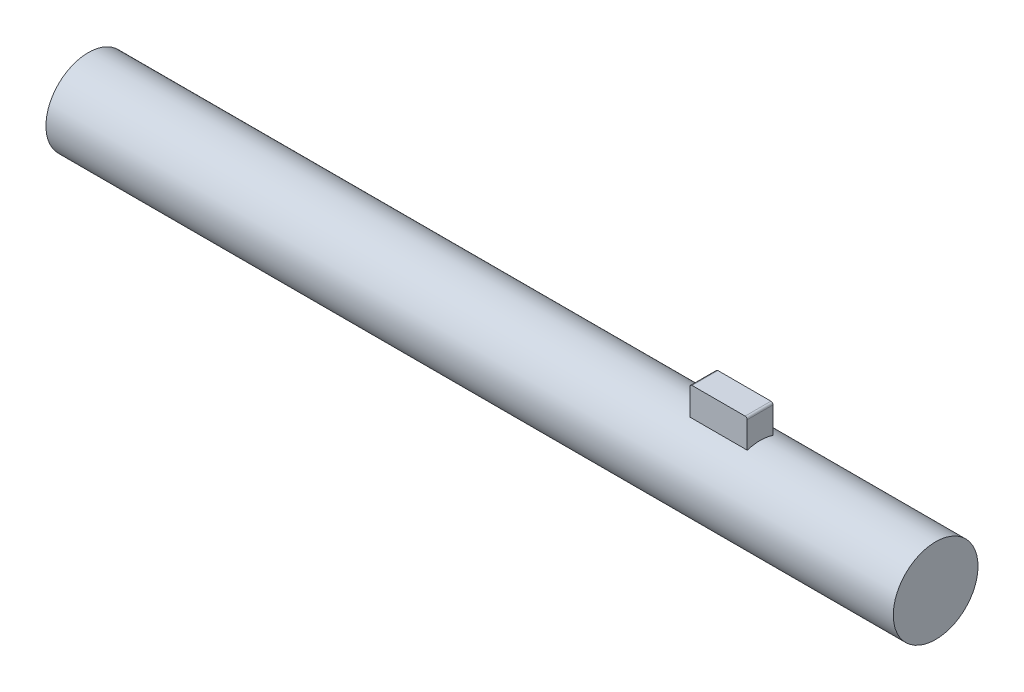
ISO-10303-21;
HEADER;
FILE_DESCRIPTION(('STEP AP214'),'2;1');
FILE_NAME('part.step','',(''),(''),'','','');
FILE_SCHEMA(('AUTOMOTIVE_DESIGN { 1 0 10303 214 1 1 1 1 }'));
ENDSEC;
DATA;
#1=APPLICATION_CONTEXT('core data for automotive mechanical design processes');
#2=APPLICATION_PROTOCOL_DEFINITION('international standard','automotive_design',2000,#1);
#3=PRODUCT_CONTEXT('',#1,'mechanical');
#4=PRODUCT('Part','Part','',(#3));
#5=PRODUCT_RELATED_PRODUCT_CATEGORY('part','',(#4));
#6=PRODUCT_DEFINITION_FORMATION('','',#4);
#7=PRODUCT_DEFINITION_CONTEXT('part definition',#1,'design');
#8=PRODUCT_DEFINITION('design','',#6,#7);
#9=PRODUCT_DEFINITION_SHAPE('','',#8);
#10=(LENGTH_UNIT() NAMED_UNIT(*) SI_UNIT(.MILLI.,.METRE.));
#11=(NAMED_UNIT(*) PLANE_ANGLE_UNIT() SI_UNIT($,.RADIAN.));
#12=(NAMED_UNIT(*) SI_UNIT($,.STERADIAN.) SOLID_ANGLE_UNIT());
#13=UNCERTAINTY_MEASURE_WITH_UNIT(LENGTH_MEASURE(1.E-05),#10,'distance_accuracy_value','');
#14=(GEOMETRIC_REPRESENTATION_CONTEXT(3) GLOBAL_UNCERTAINTY_ASSIGNED_CONTEXT((#13)) GLOBAL_UNIT_ASSIGNED_CONTEXT((#10,
#11,#12)) REPRESENTATION_CONTEXT('',''));
#15=CARTESIAN_POINT('',(0.,0.,0.));
#16=DIRECTION('',(0.,0.,1.));
#17=DIRECTION('',(1.,0.,0.));
#18=AXIS2_PLACEMENT_3D('',#15,#16,#17);
#19=CARTESIAN_POINT('',(80.,0.,0.));
#20=DIRECTION('',(-1.,0.,0.));
#21=DIRECTION('',(0.,0.,1.));
#22=AXIS2_PLACEMENT_3D('',#19,#20,#21);
#23=CYLINDRICAL_SURFACE('',#22,4.);
#24=CARTESIAN_POINT('',(0.,0.,0.));
#25=DIRECTION('',(1.,0.,0.));
#26=DIRECTION('',(0.,0.,-1.));
#27=AXIS2_PLACEMENT_3D('',#24,#25,#26);
#28=CIRCLE('',#27,4.);
#29=CARTESIAN_POINT('',(0.,0.,-4.));
#30=VERTEX_POINT('',#29);
#31=EDGE_CURVE('E125',#30,#30,#28,.T.);
#32=ORIENTED_EDGE('',*,*,#31,.T.);
#33=EDGE_LOOP('',(#32));
#34=FACE_BOUND('',#33,.T.);
#35=CARTESIAN_POINT('',(80.,0.,0.));
#36=DIRECTION('',(1.,0.,0.));
#37=DIRECTION('',(0.,0.,-1.));
#38=AXIS2_PLACEMENT_3D('',#35,#36,#37);
#39=CIRCLE('',#38,4.);
#40=CARTESIAN_POINT('',(80.,0.,-4.));
#41=VERTEX_POINT('',#40);
#42=EDGE_CURVE('E126',#41,#41,#39,.T.);
#43=ORIENTED_EDGE('',*,*,#42,.F.);
#44=EDGE_LOOP('',(#43));
#45=FACE_BOUND('',#44,.T.);
#46=CARTESIAN_POINT('',(63.432455776284,0.,0.));
#47=DIRECTION('',(1.,0.,0.));
#48=DIRECTION('',(0.,0.,-1.));
#49=AXIS2_PLACEMENT_3D('',#46,#47,#48);
#50=CIRCLE('',#49,4.);
#51=CARTESIAN_POINT('',(63.432455776284,3.80963623563794,1.21929149595753));
#52=VERTEX_POINT('',#51);
#53=CARTESIAN_POINT('',(63.432455776284,3.80963623563794,-1.21929149595753));
#54=VERTEX_POINT('',#53);
#55=EDGE_CURVE('E91',#52,#54,#50,.F.);
#56=ORIENTED_EDGE('',*,*,#55,.F.);
#57=DIRECTION('',(-1.,0.,0.));
#58=VECTOR('',#57,1.);
#59=CARTESIAN_POINT('',(80.,3.80963623563794,1.21929149595753));
#60=LINE('',#59,#58);
#61=CARTESIAN_POINT('',(58.0268327496329,3.80963623563794,1.21929149595753));
#62=VERTEX_POINT('',#61);
#63=EDGE_CURVE('E103',#62,#52,#60,.F.);
#64=ORIENTED_EDGE('',*,*,#63,.F.);
#65=CARTESIAN_POINT('',(58.0268327496329,0.,0.));
#66=DIRECTION('',(-1.,0.,0.));
#67=DIRECTION('',(0.,0.,1.));
#68=AXIS2_PLACEMENT_3D('',#65,#66,#67);
#69=CIRCLE('',#68,4.);
#70=CARTESIAN_POINT('',(58.0268327496329,3.80963623563794,-1.21929149595753));
#71=VERTEX_POINT('',#70);
#72=EDGE_CURVE('E111',#71,#62,#69,.F.);
#73=ORIENTED_EDGE('',*,*,#72,.F.);
#74=DIRECTION('',(-1.,0.,0.));
#75=VECTOR('',#74,1.);
#76=CARTESIAN_POINT('',(80.,3.80963623563794,-1.21929149595753));
#77=LINE('',#76,#75);
#78=EDGE_CURVE('E106',#54,#71,#77,.T.);
#79=ORIENTED_EDGE('',*,*,#78,.F.);
#80=EDGE_LOOP('',(#56,#64,#73,#79));
#81=FACE_BOUND('',#80,.T.);
#82=ADVANCED_FACE('F35',(#34,#45,#81),#23,.T.);
#83=CARTESIAN_POINT('',(80.,0.,0.));
#84=DIRECTION('',(1.,0.,0.));
#85=DIRECTION('',(0.,0.,-1.));
#86=AXIS2_PLACEMENT_3D('',#83,#84,#85);
#87=PLANE('',#86);
#88=ORIENTED_EDGE('',*,*,#42,.T.);
#89=EDGE_LOOP('',(#88));
#90=FACE_BOUND('',#89,.T.);
#91=ADVANCED_FACE('F157',(#90),#87,.T.);
#92=CARTESIAN_POINT('',(0.,0.,0.));
#93=DIRECTION('',(1.,0.,0.));
#94=DIRECTION('',(0.,0.,-1.));
#95=AXIS2_PLACEMENT_3D('',#92,#93,#94);
#96=PLANE('',#95);
#97=ORIENTED_EDGE('',*,*,#31,.F.);
#98=EDGE_LOOP('',(#97));
#99=FACE_BOUND('',#98,.T.);
#100=ADVANCED_FACE('F163',(#99),#96,.F.);
#101=CARTESIAN_POINT('',(63.432455776284,6.5,1.21929149595753));
#102=DIRECTION('',(-1.,0.,0.));
#103=DIRECTION('',(0.,0.,1.));
#104=AXIS2_PLACEMENT_3D('',#101,#102,#103);
#105=PLANE('',#104);
#106=DIRECTION('',(0.,-1.,0.));
#107=VECTOR('',#106,1.);
#108=CARTESIAN_POINT('',(63.432455776284,6.5,-1.21929149595753));
#109=LINE('',#108,#107);
#110=CARTESIAN_POINT('',(63.432455776284,6.3,-1.21929149595753));
#111=VERTEX_POINT('',#110);
#112=EDGE_CURVE('E123',#111,#54,#109,.T.);
#113=ORIENTED_EDGE('',*,*,#112,.F.);
#114=DIRECTION('',(0.,0.,-1.));
#115=VECTOR('',#114,1.);
#116=CARTESIAN_POINT('',(63.432455776284,6.3,1.21929149595753));
#117=LINE('',#116,#115);
#118=CARTESIAN_POINT('',(63.432455776284,6.3,1.21929149595753));
#119=VERTEX_POINT('',#118);
#120=EDGE_CURVE('E11',#111,#119,#117,.F.);
#121=ORIENTED_EDGE('',*,*,#120,.T.);
#122=DIRECTION('',(0.,-1.,0.));
#123=VECTOR('',#122,1.);
#124=CARTESIAN_POINT('',(63.432455776284,6.5,1.21929149595753));
#125=LINE('',#124,#123);
#126=EDGE_CURVE('E88',#119,#52,#125,.T.);
#127=ORIENTED_EDGE('',*,*,#126,.T.);
#128=ORIENTED_EDGE('',*,*,#55,.T.);
#129=EDGE_LOOP('',(#113,#121,#127,#128));
#130=FACE_BOUND('',#129,.T.);
#131=ADVANCED_FACE('F90',(#130),#105,.F.);
#132=CARTESIAN_POINT('',(58.0268327496329,6.5,-1.21929149595753));
#133=DIRECTION('',(0.,0.,1.));
#134=DIRECTION('',(1.,0.,0.));
#135=AXIS2_PLACEMENT_3D('',#132,#133,#134);
#136=PLANE('',#135);
#137=DIRECTION('',(0.,-1.,0.));
#138=VECTOR('',#137,1.);
#139=CARTESIAN_POINT('',(58.0268327496329,6.5,-1.21929149595753));
#140=LINE('',#139,#138);
#141=CARTESIAN_POINT('',(58.0268327496329,6.3,-1.21929149595753));
#142=VERTEX_POINT('',#141);
#143=EDGE_CURVE('E121',#142,#71,#140,.T.);
#144=ORIENTED_EDGE('',*,*,#143,.F.);
#145=CARTESIAN_POINT('',(58.2268327496329,6.3,-1.21929149595753));
#146=DIRECTION('',(0.,0.,1.));
#147=DIRECTION('',(1.,0.,0.));
#148=AXIS2_PLACEMENT_3D('',#145,#146,#147);
#149=CIRCLE('',#148,0.2);
#150=CARTESIAN_POINT('',(58.2268327496329,6.5,-1.21929149595753));
#151=VERTEX_POINT('',#150);
#152=EDGE_CURVE('E43',#142,#151,#149,.F.);
#153=ORIENTED_EDGE('',*,*,#152,.T.);
#154=DIRECTION('',(-1.,0.,0.));
#155=VECTOR('',#154,1.);
#156=CARTESIAN_POINT('',(58.0268327496329,6.5,-1.21929149595753));
#157=LINE('',#156,#155);
#158=CARTESIAN_POINT('',(63.2324557762839,6.5,-1.21929149595753));
#159=VERTEX_POINT('',#158);
#160=EDGE_CURVE('E107',#159,#151,#157,.T.);
#161=ORIENTED_EDGE('',*,*,#160,.F.);
#162=CARTESIAN_POINT('',(63.2324557762839,6.3,-1.21929149595753));
#163=DIRECTION('',(0.,0.,1.));
#164=DIRECTION('',(1.,0.,0.));
#165=AXIS2_PLACEMENT_3D('',#162,#163,#164);
#166=CIRCLE('',#165,0.2);
#167=EDGE_CURVE('E50',#159,#111,#166,.F.);
#168=ORIENTED_EDGE('',*,*,#167,.T.);
#169=ORIENTED_EDGE('',*,*,#112,.T.);
#170=ORIENTED_EDGE('',*,*,#78,.T.);
#171=EDGE_LOOP('',(#144,#153,#161,#168,#169,#170));
#172=FACE_BOUND('',#171,.T.);
#173=ADVANCED_FACE('F143',(#172),#136,.F.);
#174=CARTESIAN_POINT('',(58.0268327496329,6.5,1.21929149595753));
#175=DIRECTION('',(1.,0.,0.));
#176=DIRECTION('',(0.,0.,-1.));
#177=AXIS2_PLACEMENT_3D('',#174,#175,#176);
#178=PLANE('',#177);
#179=DIRECTION('',(0.,-1.,0.));
#180=VECTOR('',#179,1.);
#181=CARTESIAN_POINT('',(58.0268327496329,6.5,1.21929149595753));
#182=LINE('',#181,#180);
#183=CARTESIAN_POINT('',(58.0268327496329,6.3,1.21929149595753));
#184=VERTEX_POINT('',#183);
#185=EDGE_CURVE('E96',#184,#62,#182,.T.);
#186=ORIENTED_EDGE('',*,*,#185,.F.);
#187=DIRECTION('',(0.,0.,1.));
#188=VECTOR('',#187,1.);
#189=CARTESIAN_POINT('',(58.0268327496329,6.3,1.21929149595753));
#190=LINE('',#189,#188);
#191=EDGE_CURVE('E58',#184,#142,#190,.F.);
#192=ORIENTED_EDGE('',*,*,#191,.T.);
#193=ORIENTED_EDGE('',*,*,#143,.T.);
#194=ORIENTED_EDGE('',*,*,#72,.T.);
#195=EDGE_LOOP('',(#186,#192,#193,#194));
#196=FACE_BOUND('',#195,.T.);
#197=ADVANCED_FACE('F150',(#196),#178,.F.);
#198=CARTESIAN_POINT('',(58.0268327496329,6.5,1.21929149595753));
#199=DIRECTION('',(0.,0.,-1.));
#200=DIRECTION('',(-1.,0.,0.));
#201=AXIS2_PLACEMENT_3D('',#198,#199,#200);
#202=PLANE('',#201);
#203=DIRECTION('',(1.,0.,0.));
#204=VECTOR('',#203,1.);
#205=CARTESIAN_POINT('',(58.0268327496329,6.5,1.21929149595753));
#206=LINE('',#205,#204);
#207=CARTESIAN_POINT('',(58.2268327496329,6.5,1.21929149595753));
#208=VERTEX_POINT('',#207);
#209=CARTESIAN_POINT('',(63.2324557762839,6.5,1.21929149595753));
#210=VERTEX_POINT('',#209);
#211=EDGE_CURVE('E97',#208,#210,#206,.T.);
#212=ORIENTED_EDGE('',*,*,#211,.F.);
#213=CARTESIAN_POINT('',(58.2268327496329,6.3,1.21929149595753));
#214=DIRECTION('',(0.,0.,-1.));
#215=DIRECTION('',(-1.,0.,0.));
#216=AXIS2_PLACEMENT_3D('',#213,#214,#215);
#217=CIRCLE('',#216,0.2);
#218=EDGE_CURVE('E139',#208,#184,#217,.F.);
#219=ORIENTED_EDGE('',*,*,#218,.T.);
#220=ORIENTED_EDGE('',*,*,#185,.T.);
#221=ORIENTED_EDGE('',*,*,#63,.T.);
#222=ORIENTED_EDGE('',*,*,#126,.F.);
#223=CARTESIAN_POINT('',(63.2324557762839,6.3,1.21929149595753));
#224=DIRECTION('',(0.,0.,-1.));
#225=DIRECTION('',(-1.,0.,0.));
#226=AXIS2_PLACEMENT_3D('',#223,#224,#225);
#227=CIRCLE('',#226,0.2);
#228=EDGE_CURVE('E137',#119,#210,#227,.F.);
#229=ORIENTED_EDGE('',*,*,#228,.T.);
#230=EDGE_LOOP('',(#212,#219,#220,#221,#222,#229));
#231=FACE_BOUND('',#230,.T.);
#232=ADVANCED_FACE('F110',(#231),#202,.F.);
#233=CARTESIAN_POINT('',(0.,6.5,0.));
#234=DIRECTION('',(0.,-1.,0.));
#235=DIRECTION('',(0.,0.,-1.));
#236=AXIS2_PLACEMENT_3D('',#233,#234,#235);
#237=PLANE('',#236);
#238=ORIENTED_EDGE('',*,*,#160,.T.);
#239=DIRECTION('',(0.,0.,1.));
#240=VECTOR('',#239,1.);
#241=CARTESIAN_POINT('',(58.2268327496329,6.5,0.));
#242=LINE('',#241,#240);
#243=EDGE_CURVE('E134',#151,#208,#242,.T.);
#244=ORIENTED_EDGE('',*,*,#243,.T.);
#245=ORIENTED_EDGE('',*,*,#211,.T.);
#246=DIRECTION('',(0.,0.,-1.));
#247=VECTOR('',#246,1.);
#248=CARTESIAN_POINT('',(63.2324557762839,6.5,0.));
#249=LINE('',#248,#247);
#250=EDGE_CURVE('E129',#210,#159,#249,.T.);
#251=ORIENTED_EDGE('',*,*,#250,.T.);
#252=EDGE_LOOP('',(#238,#244,#245,#251));
#253=FACE_BOUND('',#252,.T.);
#254=ADVANCED_FACE('F147',(#253),#237,.F.);
#255=CARTESIAN_POINT('',(58.2268327496329,6.3,0.));
#256=DIRECTION('',(0.,0.,1.));
#257=DIRECTION('',(1.,0.,0.));
#258=AXIS2_PLACEMENT_3D('',#255,#256,#257);
#259=CYLINDRICAL_SURFACE('',#258,0.2);
#260=ORIENTED_EDGE('',*,*,#152,.F.);
#261=ORIENTED_EDGE('',*,*,#191,.F.);
#262=ORIENTED_EDGE('',*,*,#218,.F.);
#263=ORIENTED_EDGE('',*,*,#243,.F.);
#264=EDGE_LOOP('',(#260,#261,#262,#263));
#265=FACE_BOUND('',#264,.T.);
#266=ADVANCED_FACE('F149',(#265),#259,.T.);
#267=CARTESIAN_POINT('',(63.2324557762839,6.3,0.));
#268=DIRECTION('',(0.,0.,-1.));
#269=DIRECTION('',(-1.,0.,0.));
#270=AXIS2_PLACEMENT_3D('',#267,#268,#269);
#271=CYLINDRICAL_SURFACE('',#270,0.2);
#272=ORIENTED_EDGE('',*,*,#228,.F.);
#273=ORIENTED_EDGE('',*,*,#120,.F.);
#274=ORIENTED_EDGE('',*,*,#167,.F.);
#275=ORIENTED_EDGE('',*,*,#250,.F.);
#276=EDGE_LOOP('',(#272,#273,#274,#275));
#277=FACE_BOUND('',#276,.T.);
#278=ADVANCED_FACE('F37',(#277),#271,.T.);
#279=CLOSED_SHELL('',(#82,#91,#100,#131,#173,#197,#232,#254,#266,#278));
#280=MANIFOLD_SOLID_BREP('B2',#279);
#281=ADVANCED_BREP_SHAPE_REPRESENTATION('',(#18,#280),#14);
#282=SHAPE_DEFINITION_REPRESENTATION(#9,#281);
ENDSEC;
END-ISO-10303-21;
